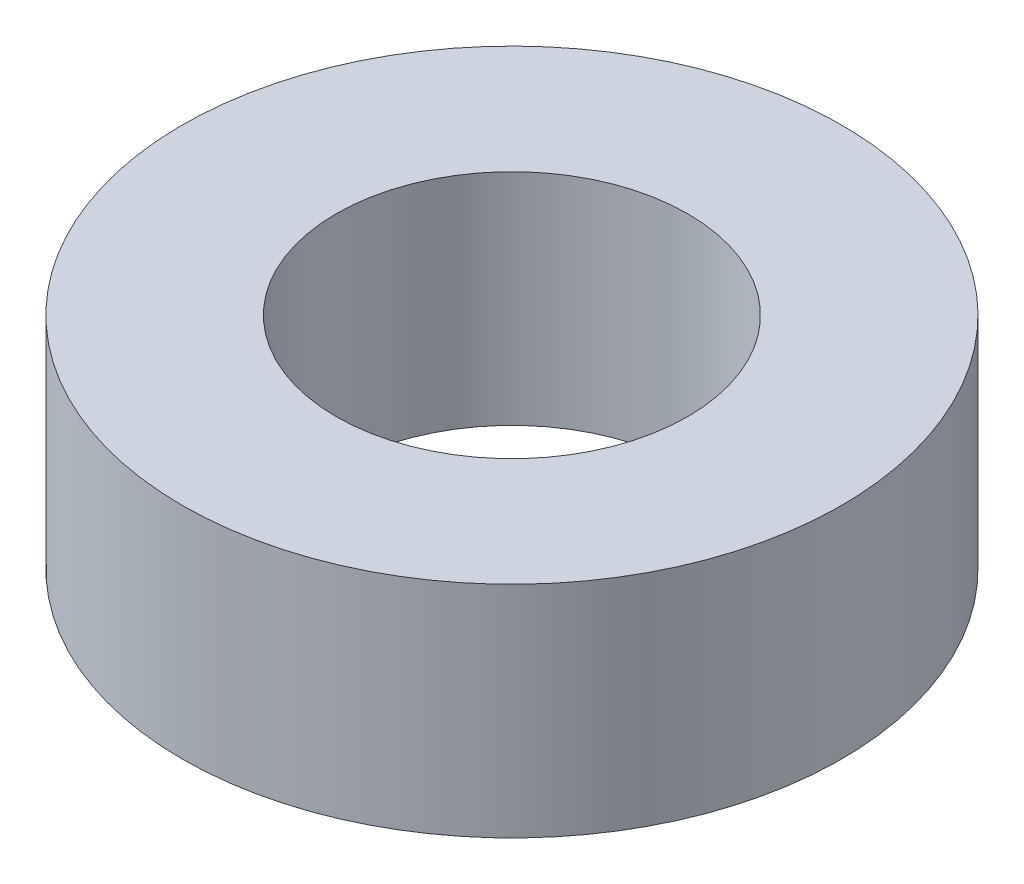
ISO-10303-21;
HEADER;
FILE_DESCRIPTION(('STEP AP214'),'2;1');
FILE_NAME('part.step','',(''),(''),'','','');
FILE_SCHEMA(('AUTOMOTIVE_DESIGN { 1 0 10303 214 1 1 1 1 }'));
ENDSEC;
DATA;
#1=APPLICATION_CONTEXT('core data for automotive mechanical design processes');
#2=APPLICATION_PROTOCOL_DEFINITION('international standard','automotive_design',2000,#1);
#3=PRODUCT_CONTEXT('',#1,'mechanical');
#4=PRODUCT('Part','Part','',(#3));
#5=PRODUCT_RELATED_PRODUCT_CATEGORY('part','',(#4));
#6=PRODUCT_DEFINITION_FORMATION('','',#4);
#7=PRODUCT_DEFINITION_CONTEXT('part definition',#1,'design');
#8=PRODUCT_DEFINITION('design','',#6,#7);
#9=PRODUCT_DEFINITION_SHAPE('','',#8);
#10=(LENGTH_UNIT() NAMED_UNIT(*) SI_UNIT(.MILLI.,.METRE.));
#11=(NAMED_UNIT(*) PLANE_ANGLE_UNIT() SI_UNIT($,.RADIAN.));
#12=(NAMED_UNIT(*) SI_UNIT($,.STERADIAN.) SOLID_ANGLE_UNIT());
#13=UNCERTAINTY_MEASURE_WITH_UNIT(LENGTH_MEASURE(1.E-05),#10,'distance_accuracy_value','');
#14=(GEOMETRIC_REPRESENTATION_CONTEXT(3) GLOBAL_UNCERTAINTY_ASSIGNED_CONTEXT((#13)) GLOBAL_UNIT_ASSIGNED_CONTEXT((#10,
#11,#12)) REPRESENTATION_CONTEXT('',''));
#15=CARTESIAN_POINT('',(0.,0.,0.));
#16=DIRECTION('',(0.,0.,1.));
#17=DIRECTION('',(1.,0.,0.));
#18=AXIS2_PLACEMENT_3D('',#15,#16,#17);
#19=CARTESIAN_POINT('',(0.,2.,0.));
#20=DIRECTION('',(0.,1.,0.));
#21=DIRECTION('',(0.,0.,1.));
#22=AXIS2_PLACEMENT_3D('',#19,#20,#21);
#23=PLANE('',#22);
#24=CARTESIAN_POINT('',(0.,2.,0.));
#25=DIRECTION('',(0.,1.,0.));
#26=DIRECTION('',(0.,0.,1.));
#27=AXIS2_PLACEMENT_3D('',#24,#25,#26);
#28=CIRCLE('',#27,3.);
#29=CARTESIAN_POINT('',(0.,2.,3.));
#30=VERTEX_POINT('',#29);
#31=EDGE_CURVE('E10',#30,#30,#28,.T.);
#32=ORIENTED_EDGE('',*,*,#31,.T.);
#33=EDGE_LOOP('',(#32));
#34=FACE_BOUND('',#33,.T.);
#35=CARTESIAN_POINT('',(0.,2.,0.));
#36=DIRECTION('',(0.,1.,0.));
#37=DIRECTION('',(0.,0.,1.));
#38=AXIS2_PLACEMENT_3D('',#35,#36,#37);
#39=CIRCLE('',#38,1.6);
#40=CARTESIAN_POINT('',(0.,2.,1.6));
#41=VERTEX_POINT('',#40);
#42=EDGE_CURVE('E42',#41,#41,#39,.T.);
#43=ORIENTED_EDGE('',*,*,#42,.F.);
#44=EDGE_LOOP('',(#43));
#45=FACE_BOUND('',#44,.T.);
#46=ADVANCED_FACE('F31',(#34,#45),#23,.T.);
#47=CARTESIAN_POINT('',(0.,0.,0.));
#48=DIRECTION('',(0.,1.,0.));
#49=DIRECTION('',(0.,0.,1.));
#50=AXIS2_PLACEMENT_3D('',#47,#48,#49);
#51=PLANE('',#50);
#52=CARTESIAN_POINT('',(0.,0.,0.));
#53=DIRECTION('',(0.,1.,0.));
#54=DIRECTION('',(0.,0.,1.));
#55=AXIS2_PLACEMENT_3D('',#52,#53,#54);
#56=CIRCLE('',#55,3.);
#57=CARTESIAN_POINT('',(0.,0.,3.));
#58=VERTEX_POINT('',#57);
#59=EDGE_CURVE('E35',#58,#58,#56,.T.);
#60=ORIENTED_EDGE('',*,*,#59,.F.);
#61=EDGE_LOOP('',(#60));
#62=FACE_BOUND('',#61,.T.);
#63=CARTESIAN_POINT('',(0.,0.,0.));
#64=DIRECTION('',(0.,1.,0.));
#65=DIRECTION('',(0.,0.,1.));
#66=AXIS2_PLACEMENT_3D('',#63,#64,#65);
#67=CIRCLE('',#66,1.6);
#68=CARTESIAN_POINT('',(0.,0.,1.6));
#69=VERTEX_POINT('',#68);
#70=EDGE_CURVE('E44',#69,#69,#67,.T.);
#71=ORIENTED_EDGE('',*,*,#70,.T.);
#72=EDGE_LOOP('',(#71));
#73=FACE_BOUND('',#72,.T.);
#74=ADVANCED_FACE('F54',(#62,#73),#51,.F.);
#75=CARTESIAN_POINT('',(0.,2.,0.));
#76=DIRECTION('',(0.,-1.,0.));
#77=DIRECTION('',(0.,0.,-1.));
#78=AXIS2_PLACEMENT_3D('',#75,#76,#77);
#79=CYLINDRICAL_SURFACE('',#78,3.);
#80=ORIENTED_EDGE('',*,*,#31,.F.);
#81=EDGE_LOOP('',(#80));
#82=FACE_BOUND('',#81,.T.);
#83=ORIENTED_EDGE('',*,*,#59,.T.);
#84=EDGE_LOOP('',(#83));
#85=FACE_BOUND('',#84,.T.);
#86=ADVANCED_FACE('F33',(#82,#85),#79,.T.);
#87=CARTESIAN_POINT('',(0.,2.,0.));
#88=DIRECTION('',(0.,-1.,0.));
#89=DIRECTION('',(0.,0.,-1.));
#90=AXIS2_PLACEMENT_3D('',#87,#88,#89);
#91=CYLINDRICAL_SURFACE('',#90,1.6);
#92=ORIENTED_EDGE('',*,*,#42,.T.);
#93=EDGE_LOOP('',(#92));
#94=FACE_BOUND('',#93,.T.);
#95=ORIENTED_EDGE('',*,*,#70,.F.);
#96=EDGE_LOOP('',(#95));
#97=FACE_BOUND('',#96,.T.);
#98=ADVANCED_FACE('F50',(#94,#97),#91,.F.);
#99=CLOSED_SHELL('',(#46,#74,#86,#98));
#100=MANIFOLD_SOLID_BREP('B2',#99);
#101=ADVANCED_BREP_SHAPE_REPRESENTATION('',(#18,#100),#14);
#102=SHAPE_DEFINITION_REPRESENTATION(#9,#101);
ENDSEC;
END-ISO-10303-21;
